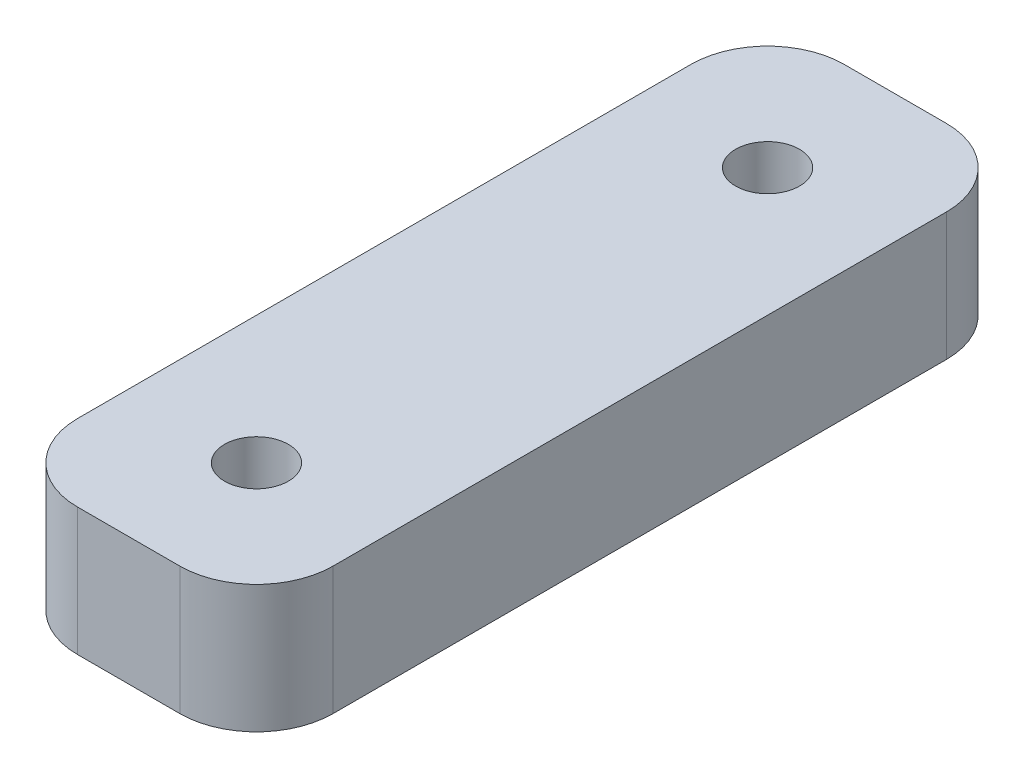
ISO-10303-21;
HEADER;
FILE_DESCRIPTION(('STEP AP214'),'2;1');
FILE_NAME('part.step','',(''),(''),'','','');
FILE_SCHEMA(('AUTOMOTIVE_DESIGN { 1 0 10303 214 1 1 1 1 }'));
ENDSEC;
DATA;
#1=APPLICATION_CONTEXT('core data for automotive mechanical design processes');
#2=APPLICATION_PROTOCOL_DEFINITION('international standard','automotive_design',2000,#1);
#3=PRODUCT_CONTEXT('',#1,'mechanical');
#4=PRODUCT('Part','Part','',(#3));
#5=PRODUCT_RELATED_PRODUCT_CATEGORY('part','',(#4));
#6=PRODUCT_DEFINITION_FORMATION('','',#4);
#7=PRODUCT_DEFINITION_CONTEXT('part definition',#1,'design');
#8=PRODUCT_DEFINITION('design','',#6,#7);
#9=PRODUCT_DEFINITION_SHAPE('','',#8);
#10=(LENGTH_UNIT() NAMED_UNIT(*) SI_UNIT(.MILLI.,.METRE.));
#11=(NAMED_UNIT(*) PLANE_ANGLE_UNIT() SI_UNIT($,.RADIAN.));
#12=(NAMED_UNIT(*) SI_UNIT($,.STERADIAN.) SOLID_ANGLE_UNIT());
#13=UNCERTAINTY_MEASURE_WITH_UNIT(LENGTH_MEASURE(1.E-05),#10,'distance_accuracy_value','');
#14=(GEOMETRIC_REPRESENTATION_CONTEXT(3) GLOBAL_UNCERTAINTY_ASSIGNED_CONTEXT((#13)) GLOBAL_UNIT_ASSIGNED_CONTEXT((#10,
#11,#12)) REPRESENTATION_CONTEXT('',''));
#15=CARTESIAN_POINT('',(0.,0.,0.));
#16=DIRECTION('',(0.,0.,1.));
#17=DIRECTION('',(1.,0.,0.));
#18=AXIS2_PLACEMENT_3D('',#15,#16,#17);
#19=CARTESIAN_POINT('',(0.,5.,0.));
#20=DIRECTION('',(0.,-1.,0.));
#21=DIRECTION('',(0.,0.,-1.));
#22=AXIS2_PLACEMENT_3D('',#19,#20,#21);
#23=PLANE('',#22);
#24=DIRECTION('',(0.,0.,-1.));
#25=VECTOR('',#24,1.);
#26=CARTESIAN_POINT('',(13.,5.,0.));
#27=LINE('',#26,#25);
#28=CARTESIAN_POINT('',(13.,5.,-3.));
#29=VERTEX_POINT('',#28);
#30=CARTESIAN_POINT('',(13.,5.,-27.));
#31=VERTEX_POINT('',#30);
#32=EDGE_CURVE('E164',#29,#31,#27,.T.);
#33=ORIENTED_EDGE('',*,*,#32,.T.);
#34=CARTESIAN_POINT('',(10.,5.,-27.));
#35=DIRECTION('',(0.,-1.,0.));
#36=DIRECTION('',(0.,0.,-1.));
#37=AXIS2_PLACEMENT_3D('',#34,#35,#36);
#38=CIRCLE('',#37,3.);
#39=CARTESIAN_POINT('',(10.,5.,-30.));
#40=VERTEX_POINT('',#39);
#41=EDGE_CURVE('E147',#31,#40,#38,.F.);
#42=ORIENTED_EDGE('',*,*,#41,.T.);
#43=DIRECTION('',(-1.,0.,0.));
#44=VECTOR('',#43,1.);
#45=CARTESIAN_POINT('',(3.,5.,-30.));
#46=LINE('',#45,#44);
#47=CARTESIAN_POINT('',(6.,5.,-30.));
#48=VERTEX_POINT('',#47);
#49=EDGE_CURVE('E118',#40,#48,#46,.T.);
#50=ORIENTED_EDGE('',*,*,#49,.T.);
#51=CARTESIAN_POINT('',(6.,5.,-27.));
#52=DIRECTION('',(0.,-1.,0.));
#53=DIRECTION('',(0.,0.,-1.));
#54=AXIS2_PLACEMENT_3D('',#51,#52,#53);
#55=CIRCLE('',#54,3.);
#56=CARTESIAN_POINT('',(3.,5.,-27.));
#57=VERTEX_POINT('',#56);
#58=EDGE_CURVE('E145',#48,#57,#55,.F.);
#59=ORIENTED_EDGE('',*,*,#58,.T.);
#60=DIRECTION('',(0.,0.,1.));
#61=VECTOR('',#60,1.);
#62=CARTESIAN_POINT('',(3.,5.,0.));
#63=LINE('',#62,#61);
#64=CARTESIAN_POINT('',(3.,5.,-3.));
#65=VERTEX_POINT('',#64);
#66=EDGE_CURVE('E125',#57,#65,#63,.T.);
#67=ORIENTED_EDGE('',*,*,#66,.T.);
#68=CARTESIAN_POINT('',(6.,5.,-3.));
#69=DIRECTION('',(0.,-1.,0.));
#70=DIRECTION('',(0.,0.,-1.));
#71=AXIS2_PLACEMENT_3D('',#68,#69,#70);
#72=CIRCLE('',#71,3.);
#73=CARTESIAN_POINT('',(6.,5.,0.));
#74=VERTEX_POINT('',#73);
#75=EDGE_CURVE('E53',#65,#74,#72,.F.);
#76=ORIENTED_EDGE('',*,*,#75,.T.);
#77=DIRECTION('',(1.,0.,0.));
#78=VECTOR('',#77,1.);
#79=CARTESIAN_POINT('',(3.,5.,0.));
#80=LINE('',#79,#78);
#81=CARTESIAN_POINT('',(10.,5.,0.));
#82=VERTEX_POINT('',#81);
#83=EDGE_CURVE('E128',#74,#82,#80,.T.);
#84=ORIENTED_EDGE('',*,*,#83,.T.);
#85=CARTESIAN_POINT('',(10.,5.,-3.));
#86=DIRECTION('',(0.,-1.,0.));
#87=DIRECTION('',(0.,0.,-1.));
#88=AXIS2_PLACEMENT_3D('',#85,#86,#87);
#89=CIRCLE('',#88,3.);
#90=EDGE_CURVE('E143',#82,#29,#89,.F.);
#91=ORIENTED_EDGE('',*,*,#90,.T.);
#92=EDGE_LOOP('',(#33,#42,#50,#59,#67,#76,#84,#91));
#93=FACE_BOUND('',#92,.T.);
#94=CARTESIAN_POINT('',(8.,5.,-25.));
#95=DIRECTION('',(0.,1.,0.));
#96=DIRECTION('',(0.,0.,1.));
#97=AXIS2_PLACEMENT_3D('',#94,#95,#96);
#98=CIRCLE('',#97,1.25);
#99=CARTESIAN_POINT('',(8.,5.,-23.75));
#100=VERTEX_POINT('',#99);
#101=EDGE_CURVE('E160',#100,#100,#98,.T.);
#102=ORIENTED_EDGE('',*,*,#101,.F.);
#103=EDGE_LOOP('',(#102));
#104=FACE_BOUND('',#103,.T.);
#105=CARTESIAN_POINT('',(8.,5.,-5.));
#106=DIRECTION('',(0.,1.,0.));
#107=DIRECTION('',(0.,0.,1.));
#108=AXIS2_PLACEMENT_3D('',#105,#106,#107);
#109=CIRCLE('',#108,1.25);
#110=CARTESIAN_POINT('',(8.,5.,-3.75));
#111=VERTEX_POINT('',#110);
#112=EDGE_CURVE('E171',#111,#111,#109,.T.);
#113=ORIENTED_EDGE('',*,*,#112,.F.);
#114=EDGE_LOOP('',(#113));
#115=FACE_BOUND('',#114,.T.);
#116=ADVANCED_FACE('F33',(#93,#104,#115),#23,.F.);
#117=CARTESIAN_POINT('',(0.,0.,0.));
#118=DIRECTION('',(0.,-1.,0.));
#119=DIRECTION('',(0.,0.,-1.));
#120=AXIS2_PLACEMENT_3D('',#117,#118,#119);
#121=PLANE('',#120);
#122=CARTESIAN_POINT('',(8.,0.,-25.));
#123=DIRECTION('',(0.,1.,0.));
#124=DIRECTION('',(0.,0.,1.));
#125=AXIS2_PLACEMENT_3D('',#122,#123,#124);
#126=CIRCLE('',#125,1.25);
#127=CARTESIAN_POINT('',(8.,0.,-23.75));
#128=VERTEX_POINT('',#127);
#129=EDGE_CURVE('E168',#128,#128,#126,.T.);
#130=ORIENTED_EDGE('',*,*,#129,.T.);
#131=EDGE_LOOP('',(#130));
#132=FACE_BOUND('',#131,.T.);
#133=DIRECTION('',(-1.,0.,0.));
#134=VECTOR('',#133,1.);
#135=CARTESIAN_POINT('',(3.,0.,-30.));
#136=LINE('',#135,#134);
#137=CARTESIAN_POINT('',(10.,0.,-30.));
#138=VERTEX_POINT('',#137);
#139=CARTESIAN_POINT('',(6.,0.,-30.));
#140=VERTEX_POINT('',#139);
#141=EDGE_CURVE('E115',#138,#140,#136,.T.);
#142=ORIENTED_EDGE('',*,*,#141,.F.);
#143=CARTESIAN_POINT('',(10.,0.,-27.));
#144=DIRECTION('',(0.,-1.,0.));
#145=DIRECTION('',(0.,0.,-1.));
#146=AXIS2_PLACEMENT_3D('',#143,#144,#145);
#147=CIRCLE('',#146,3.);
#148=CARTESIAN_POINT('',(13.,0.,-27.));
#149=VERTEX_POINT('',#148);
#150=EDGE_CURVE('E98',#138,#149,#147,.T.);
#151=ORIENTED_EDGE('',*,*,#150,.T.);
#152=DIRECTION('',(0.,0.,-1.));
#153=VECTOR('',#152,1.);
#154=CARTESIAN_POINT('',(13.,0.,0.));
#155=LINE('',#154,#153);
#156=CARTESIAN_POINT('',(13.,0.,-3.));
#157=VERTEX_POINT('',#156);
#158=EDGE_CURVE('E126',#157,#149,#155,.T.);
#159=ORIENTED_EDGE('',*,*,#158,.F.);
#160=CARTESIAN_POINT('',(10.,0.,-3.));
#161=DIRECTION('',(0.,-1.,0.));
#162=DIRECTION('',(0.,0.,-1.));
#163=AXIS2_PLACEMENT_3D('',#160,#161,#162);
#164=CIRCLE('',#163,3.);
#165=CARTESIAN_POINT('',(10.,0.,0.));
#166=VERTEX_POINT('',#165);
#167=EDGE_CURVE('E136',#157,#166,#164,.T.);
#168=ORIENTED_EDGE('',*,*,#167,.T.);
#169=DIRECTION('',(1.,0.,0.));
#170=VECTOR('',#169,1.);
#171=CARTESIAN_POINT('',(3.,0.,0.));
#172=LINE('',#171,#170);
#173=CARTESIAN_POINT('',(6.,0.,0.));
#174=VERTEX_POINT('',#173);
#175=EDGE_CURVE('E130',#174,#166,#172,.T.);
#176=ORIENTED_EDGE('',*,*,#175,.F.);
#177=CARTESIAN_POINT('',(6.,0.,-3.));
#178=DIRECTION('',(0.,-1.,0.));
#179=DIRECTION('',(0.,0.,-1.));
#180=AXIS2_PLACEMENT_3D('',#177,#178,#179);
#181=CIRCLE('',#180,3.);
#182=CARTESIAN_POINT('',(3.,0.,-3.));
#183=VERTEX_POINT('',#182);
#184=EDGE_CURVE('E119',#174,#183,#181,.T.);
#185=ORIENTED_EDGE('',*,*,#184,.T.);
#186=DIRECTION('',(0.,0.,1.));
#187=VECTOR('',#186,1.);
#188=CARTESIAN_POINT('',(3.,0.,0.));
#189=LINE('',#188,#187);
#190=CARTESIAN_POINT('',(3.,0.,-27.));
#191=VERTEX_POINT('',#190);
#192=EDGE_CURVE('E159',#191,#183,#189,.T.);
#193=ORIENTED_EDGE('',*,*,#192,.F.);
#194=CARTESIAN_POINT('',(6.,0.,-27.));
#195=DIRECTION('',(0.,-1.,0.));
#196=DIRECTION('',(0.,0.,-1.));
#197=AXIS2_PLACEMENT_3D('',#194,#195,#196);
#198=CIRCLE('',#197,3.);
#199=EDGE_CURVE('E109',#191,#140,#198,.T.);
#200=ORIENTED_EDGE('',*,*,#199,.T.);
#201=EDGE_LOOP('',(#142,#151,#159,#168,#176,#185,#193,#200));
#202=FACE_BOUND('',#201,.T.);
#203=CARTESIAN_POINT('',(8.,0.,-5.));
#204=DIRECTION('',(0.,1.,0.));
#205=DIRECTION('',(0.,0.,1.));
#206=AXIS2_PLACEMENT_3D('',#203,#204,#205);
#207=CIRCLE('',#206,1.25);
#208=CARTESIAN_POINT('',(8.,0.,-3.75));
#209=VERTEX_POINT('',#208);
#210=EDGE_CURVE('E174',#209,#209,#207,.T.);
#211=ORIENTED_EDGE('',*,*,#210,.T.);
#212=EDGE_LOOP('',(#211));
#213=FACE_BOUND('',#212,.T.);
#214=ADVANCED_FACE('F122',(#132,#202,#213),#121,.T.);
#215=CARTESIAN_POINT('',(3.,5.,0.));
#216=DIRECTION('',(1.,0.,0.));
#217=DIRECTION('',(0.,0.,-1.));
#218=AXIS2_PLACEMENT_3D('',#215,#216,#217);
#219=PLANE('',#218);
#220=ORIENTED_EDGE('',*,*,#66,.F.);
#221=DIRECTION('',(0.,-1.,0.));
#222=VECTOR('',#221,1.);
#223=CARTESIAN_POINT('',(3.,5.,-27.));
#224=LINE('',#223,#222);
#225=EDGE_CURVE('E151',#57,#191,#224,.T.);
#226=ORIENTED_EDGE('',*,*,#225,.T.);
#227=ORIENTED_EDGE('',*,*,#192,.T.);
#228=DIRECTION('',(0.,-1.,0.));
#229=VECTOR('',#228,1.);
#230=CARTESIAN_POINT('',(3.,5.,-3.));
#231=LINE('',#230,#229);
#232=EDGE_CURVE('E149',#183,#65,#231,.F.);
#233=ORIENTED_EDGE('',*,*,#232,.T.);
#234=EDGE_LOOP('',(#220,#226,#227,#233));
#235=FACE_BOUND('',#234,.T.);
#236=ADVANCED_FACE('F188',(#235),#219,.F.);
#237=CARTESIAN_POINT('',(3.,5.,0.));
#238=DIRECTION('',(0.,0.,-1.));
#239=DIRECTION('',(-1.,0.,0.));
#240=AXIS2_PLACEMENT_3D('',#237,#238,#239);
#241=PLANE('',#240);
#242=ORIENTED_EDGE('',*,*,#175,.T.);
#243=DIRECTION('',(0.,-1.,0.));
#244=VECTOR('',#243,1.);
#245=CARTESIAN_POINT('',(10.,5.,0.));
#246=LINE('',#245,#244);
#247=EDGE_CURVE('E11',#166,#82,#246,.F.);
#248=ORIENTED_EDGE('',*,*,#247,.T.);
#249=ORIENTED_EDGE('',*,*,#83,.F.);
#250=DIRECTION('',(0.,-1.,0.));
#251=VECTOR('',#250,1.);
#252=CARTESIAN_POINT('',(6.,5.,0.));
#253=LINE('',#252,#251);
#254=EDGE_CURVE('E41',#74,#174,#253,.T.);
#255=ORIENTED_EDGE('',*,*,#254,.T.);
#256=EDGE_LOOP('',(#242,#248,#249,#255));
#257=FACE_BOUND('',#256,.T.);
#258=ADVANCED_FACE('F156',(#257),#241,.F.);
#259=CARTESIAN_POINT('',(13.,5.,0.));
#260=DIRECTION('',(-1.,0.,0.));
#261=DIRECTION('',(0.,0.,1.));
#262=AXIS2_PLACEMENT_3D('',#259,#260,#261);
#263=PLANE('',#262);
#264=ORIENTED_EDGE('',*,*,#158,.T.);
#265=DIRECTION('',(0.,-1.,0.));
#266=VECTOR('',#265,1.);
#267=CARTESIAN_POINT('',(13.,5.,-27.));
#268=LINE('',#267,#266);
#269=EDGE_CURVE('E103',#149,#31,#268,.F.);
#270=ORIENTED_EDGE('',*,*,#269,.T.);
#271=ORIENTED_EDGE('',*,*,#32,.F.);
#272=DIRECTION('',(0.,-1.,0.));
#273=VECTOR('',#272,1.);
#274=CARTESIAN_POINT('',(13.,5.,-3.));
#275=LINE('',#274,#273);
#276=EDGE_CURVE('E108',#29,#157,#275,.T.);
#277=ORIENTED_EDGE('',*,*,#276,.T.);
#278=EDGE_LOOP('',(#264,#270,#271,#277));
#279=FACE_BOUND('',#278,.T.);
#280=ADVANCED_FACE('F198',(#279),#263,.F.);
#281=CARTESIAN_POINT('',(3.,5.,-30.));
#282=DIRECTION('',(0.,0.,1.));
#283=DIRECTION('',(1.,0.,0.));
#284=AXIS2_PLACEMENT_3D('',#281,#282,#283);
#285=PLANE('',#284);
#286=ORIENTED_EDGE('',*,*,#49,.F.);
#287=DIRECTION('',(0.,-1.,0.));
#288=VECTOR('',#287,1.);
#289=CARTESIAN_POINT('',(10.,5.,-30.));
#290=LINE('',#289,#288);
#291=EDGE_CURVE('E102',#40,#138,#290,.T.);
#292=ORIENTED_EDGE('',*,*,#291,.T.);
#293=ORIENTED_EDGE('',*,*,#141,.T.);
#294=DIRECTION('',(0.,-1.,0.));
#295=VECTOR('',#294,1.);
#296=CARTESIAN_POINT('',(6.,5.,-30.));
#297=LINE('',#296,#295);
#298=EDGE_CURVE('E120',#140,#48,#297,.F.);
#299=ORIENTED_EDGE('',*,*,#298,.T.);
#300=EDGE_LOOP('',(#286,#292,#293,#299));
#301=FACE_BOUND('',#300,.T.);
#302=ADVANCED_FACE('F114',(#301),#285,.F.);
#303=CARTESIAN_POINT('',(8.,5.,-25.));
#304=DIRECTION('',(0.,-1.,0.));
#305=DIRECTION('',(0.,0.,-1.));
#306=AXIS2_PLACEMENT_3D('',#303,#304,#305);
#307=CYLINDRICAL_SURFACE('',#306,1.25);
#308=ORIENTED_EDGE('',*,*,#101,.T.);
#309=EDGE_LOOP('',(#308));
#310=FACE_BOUND('',#309,.T.);
#311=ORIENTED_EDGE('',*,*,#129,.F.);
#312=EDGE_LOOP('',(#311));
#313=FACE_BOUND('',#312,.T.);
#314=ADVANCED_FACE('F193',(#310,#313),#307,.F.);
#315=CARTESIAN_POINT('',(8.,5.,-5.));
#316=DIRECTION('',(0.,-1.,0.));
#317=DIRECTION('',(0.,0.,-1.));
#318=AXIS2_PLACEMENT_3D('',#315,#316,#317);
#319=CYLINDRICAL_SURFACE('',#318,1.25);
#320=ORIENTED_EDGE('',*,*,#112,.T.);
#321=EDGE_LOOP('',(#320));
#322=FACE_BOUND('',#321,.T.);
#323=ORIENTED_EDGE('',*,*,#210,.F.);
#324=EDGE_LOOP('',(#323));
#325=FACE_BOUND('',#324,.T.);
#326=ADVANCED_FACE('F180',(#322,#325),#319,.F.);
#327=CARTESIAN_POINT('',(10.,5.,-27.));
#328=DIRECTION('',(0.,-1.,0.));
#329=DIRECTION('',(0.,0.,-1.));
#330=AXIS2_PLACEMENT_3D('',#327,#328,#329);
#331=CYLINDRICAL_SURFACE('',#330,3.);
#332=ORIENTED_EDGE('',*,*,#41,.F.);
#333=ORIENTED_EDGE('',*,*,#269,.F.);
#334=ORIENTED_EDGE('',*,*,#150,.F.);
#335=ORIENTED_EDGE('',*,*,#291,.F.);
#336=EDGE_LOOP('',(#332,#333,#334,#335));
#337=FACE_BOUND('',#336,.T.);
#338=ADVANCED_FACE('F101',(#337),#331,.T.);
#339=CARTESIAN_POINT('',(6.,5.,-27.));
#340=DIRECTION('',(0.,-1.,0.));
#341=DIRECTION('',(0.,0.,-1.));
#342=AXIS2_PLACEMENT_3D('',#339,#340,#341);
#343=CYLINDRICAL_SURFACE('',#342,3.);
#344=ORIENTED_EDGE('',*,*,#58,.F.);
#345=ORIENTED_EDGE('',*,*,#298,.F.);
#346=ORIENTED_EDGE('',*,*,#199,.F.);
#347=ORIENTED_EDGE('',*,*,#225,.F.);
#348=EDGE_LOOP('',(#344,#345,#346,#347));
#349=FACE_BOUND('',#348,.T.);
#350=ADVANCED_FACE('F209',(#349),#343,.T.);
#351=CARTESIAN_POINT('',(10.,5.,-3.));
#352=DIRECTION('',(0.,-1.,0.));
#353=DIRECTION('',(0.,0.,-1.));
#354=AXIS2_PLACEMENT_3D('',#351,#352,#353);
#355=CYLINDRICAL_SURFACE('',#354,3.);
#356=ORIENTED_EDGE('',*,*,#90,.F.);
#357=ORIENTED_EDGE('',*,*,#247,.F.);
#358=ORIENTED_EDGE('',*,*,#167,.F.);
#359=ORIENTED_EDGE('',*,*,#276,.F.);
#360=EDGE_LOOP('',(#356,#357,#358,#359));
#361=FACE_BOUND('',#360,.T.);
#362=ADVANCED_FACE('F211',(#361),#355,.T.);
#363=CARTESIAN_POINT('',(6.,5.,-3.));
#364=DIRECTION('',(0.,-1.,0.));
#365=DIRECTION('',(0.,0.,-1.));
#366=AXIS2_PLACEMENT_3D('',#363,#364,#365);
#367=CYLINDRICAL_SURFACE('',#366,3.);
#368=ORIENTED_EDGE('',*,*,#75,.F.);
#369=ORIENTED_EDGE('',*,*,#232,.F.);
#370=ORIENTED_EDGE('',*,*,#184,.F.);
#371=ORIENTED_EDGE('',*,*,#254,.F.);
#372=EDGE_LOOP('',(#368,#369,#370,#371));
#373=FACE_BOUND('',#372,.T.);
#374=ADVANCED_FACE('F35',(#373),#367,.T.);
#375=CLOSED_SHELL('',(#116,#214,#236,#258,#280,#302,#314,#326,#338,#350,#362,#374));
#376=MANIFOLD_SOLID_BREP('B2',#375);
#377=ADVANCED_BREP_SHAPE_REPRESENTATION('',(#18,#376),#14);
#378=SHAPE_DEFINITION_REPRESENTATION(#9,#377);
ENDSEC;
END-ISO-10303-21;
